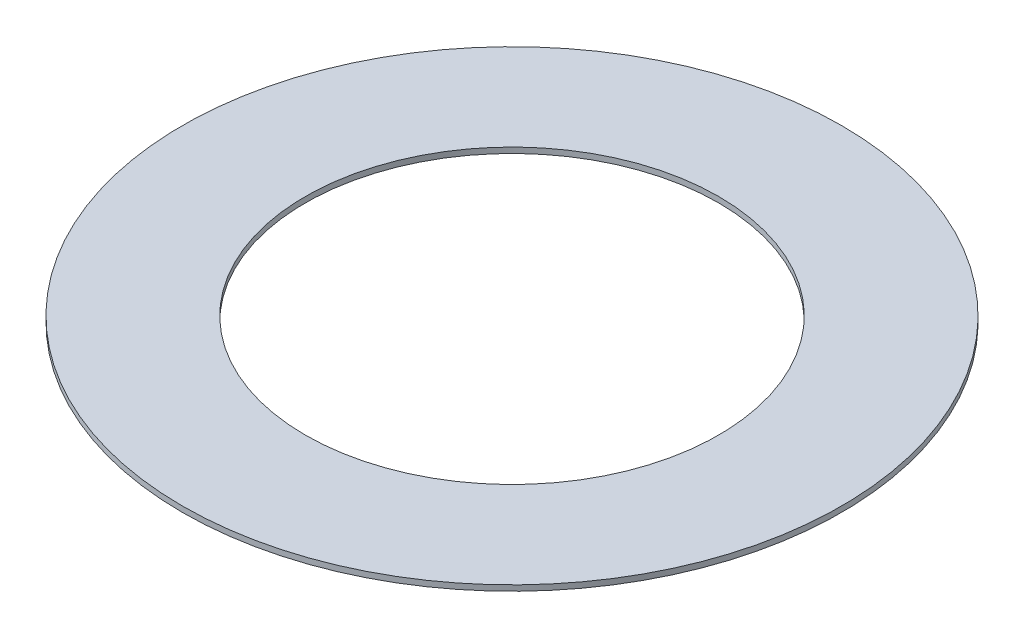
ISO-10303-21;
HEADER;
FILE_DESCRIPTION(('STEP AP214'),'2;1');
FILE_NAME('part.step','',(''),(''),'','','');
FILE_SCHEMA(('AUTOMOTIVE_DESIGN { 1 0 10303 214 1 1 1 1 }'));
ENDSEC;
DATA;
#1=APPLICATION_CONTEXT('core data for automotive mechanical design processes');
#2=APPLICATION_PROTOCOL_DEFINITION('international standard','automotive_design',2000,#1);
#3=PRODUCT_CONTEXT('',#1,'mechanical');
#4=PRODUCT('Part','Part','',(#3));
#5=PRODUCT_RELATED_PRODUCT_CATEGORY('part','',(#4));
#6=PRODUCT_DEFINITION_FORMATION('','',#4);
#7=PRODUCT_DEFINITION_CONTEXT('part definition',#1,'design');
#8=PRODUCT_DEFINITION('design','',#6,#7);
#9=PRODUCT_DEFINITION_SHAPE('','',#8);
#10=(LENGTH_UNIT() NAMED_UNIT(*) SI_UNIT(.MILLI.,.METRE.));
#11=(NAMED_UNIT(*) PLANE_ANGLE_UNIT() SI_UNIT($,.RADIAN.));
#12=(NAMED_UNIT(*) SI_UNIT($,.STERADIAN.) SOLID_ANGLE_UNIT());
#13=UNCERTAINTY_MEASURE_WITH_UNIT(LENGTH_MEASURE(1.E-05),#10,'distance_accuracy_value','');
#14=(GEOMETRIC_REPRESENTATION_CONTEXT(3) GLOBAL_UNCERTAINTY_ASSIGNED_CONTEXT((#13)) GLOBAL_UNIT_ASSIGNED_CONTEXT((#10,
#11,#12)) REPRESENTATION_CONTEXT('',''));
#15=CARTESIAN_POINT('',(0.,0.,0.));
#16=DIRECTION('',(0.,0.,1.));
#17=DIRECTION('',(1.,0.,0.));
#18=AXIS2_PLACEMENT_3D('',#15,#16,#17);
#19=CARTESIAN_POINT('',(0.,0.5,0.));
#20=DIRECTION('',(0.,-1.,0.));
#21=DIRECTION('',(0.,0.,-1.));
#22=AXIS2_PLACEMENT_3D('',#19,#20,#21);
#23=CYLINDRICAL_SURFACE('',#22,29.5);
#24=CARTESIAN_POINT('',(0.,0.5,0.));
#25=DIRECTION('',(0.,1.,0.));
#26=DIRECTION('',(0.,0.,1.));
#27=AXIS2_PLACEMENT_3D('',#24,#25,#26);
#28=CIRCLE('',#27,29.5);
#29=CARTESIAN_POINT('',(0.,0.5,29.5));
#30=VERTEX_POINT('',#29);
#31=EDGE_CURVE('E10',#30,#30,#28,.T.);
#32=ORIENTED_EDGE('',*,*,#31,.F.);
#33=EDGE_LOOP('',(#32));
#34=FACE_BOUND('',#33,.T.);
#35=CARTESIAN_POINT('',(0.,0.,0.));
#36=DIRECTION('',(0.,1.,0.));
#37=DIRECTION('',(0.,0.,1.));
#38=AXIS2_PLACEMENT_3D('',#35,#36,#37);
#39=CIRCLE('',#38,29.5);
#40=CARTESIAN_POINT('',(0.,0.,29.5));
#41=VERTEX_POINT('',#40);
#42=EDGE_CURVE('E33',#41,#41,#39,.T.);
#43=ORIENTED_EDGE('',*,*,#42,.T.);
#44=EDGE_LOOP('',(#43));
#45=FACE_BOUND('',#44,.T.);
#46=ADVANCED_FACE('F30',(#34,#45),#23,.T.);
#47=CARTESIAN_POINT('',(0.,0.5,0.));
#48=DIRECTION('',(0.,1.,0.));
#49=DIRECTION('',(0.,0.,1.));
#50=AXIS2_PLACEMENT_3D('',#47,#48,#49);
#51=PLANE('',#50);
#52=CARTESIAN_POINT('',(0.,0.5,0.));
#53=DIRECTION('',(0.,-1.,0.));
#54=DIRECTION('',(0.,0.,-1.));
#55=AXIS2_PLACEMENT_3D('',#52,#53,#54);
#56=CIRCLE('',#55,18.5);
#57=CARTESIAN_POINT('',(0.,0.5,-18.5));
#58=VERTEX_POINT('',#57);
#59=EDGE_CURVE('E40',#58,#58,#56,.T.);
#60=ORIENTED_EDGE('',*,*,#59,.T.);
#61=EDGE_LOOP('',(#60));
#62=FACE_BOUND('',#61,.T.);
#63=ORIENTED_EDGE('',*,*,#31,.T.);
#64=EDGE_LOOP('',(#63));
#65=FACE_BOUND('',#64,.T.);
#66=ADVANCED_FACE('F48',(#62,#65),#51,.T.);
#67=CARTESIAN_POINT('',(0.,0.,0.));
#68=DIRECTION('',(0.,1.,0.));
#69=DIRECTION('',(0.,0.,1.));
#70=AXIS2_PLACEMENT_3D('',#67,#68,#69);
#71=PLANE('',#70);
#72=CARTESIAN_POINT('',(0.,0.,0.));
#73=DIRECTION('',(0.,-1.,0.));
#74=DIRECTION('',(0.,0.,-1.));
#75=AXIS2_PLACEMENT_3D('',#72,#73,#74);
#76=CIRCLE('',#75,18.5);
#77=CARTESIAN_POINT('',(0.,0.,-18.5));
#78=VERTEX_POINT('',#77);
#79=EDGE_CURVE('E42',#78,#78,#76,.T.);
#80=ORIENTED_EDGE('',*,*,#79,.F.);
#81=EDGE_LOOP('',(#80));
#82=FACE_BOUND('',#81,.T.);
#83=ORIENTED_EDGE('',*,*,#42,.F.);
#84=EDGE_LOOP('',(#83));
#85=FACE_BOUND('',#84,.T.);
#86=ADVANCED_FACE('F53',(#82,#85),#71,.F.);
#87=CARTESIAN_POINT('',(0.,0.5,0.));
#88=DIRECTION('',(0.,-1.,0.));
#89=DIRECTION('',(0.,0.,-1.));
#90=AXIS2_PLACEMENT_3D('',#87,#88,#89);
#91=CYLINDRICAL_SURFACE('',#90,18.5);
#92=ORIENTED_EDGE('',*,*,#59,.F.);
#93=EDGE_LOOP('',(#92));
#94=FACE_BOUND('',#93,.T.);
#95=ORIENTED_EDGE('',*,*,#79,.T.);
#96=EDGE_LOOP('',(#95));
#97=FACE_BOUND('',#96,.T.);
#98=ADVANCED_FACE('F50',(#94,#97),#91,.F.);
#99=CLOSED_SHELL('',(#46,#66,#86,#98));
#100=MANIFOLD_SOLID_BREP('B2',#99);
#101=ADVANCED_BREP_SHAPE_REPRESENTATION('',(#18,#100),#14);
#102=SHAPE_DEFINITION_REPRESENTATION(#9,#101);
ENDSEC;
END-ISO-10303-21;
